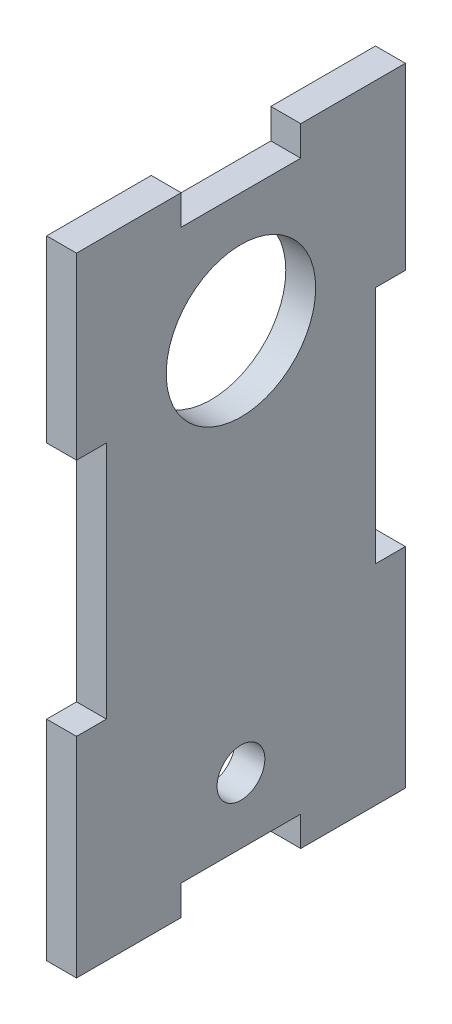
ISO-10303-21;
HEADER;
FILE_DESCRIPTION(('STEP AP214'),'2;1');
FILE_NAME('part.step','',(''),(''),'','','');
FILE_SCHEMA(('AUTOMOTIVE_DESIGN { 1 0 10303 214 1 1 1 1 }'));
ENDSEC;
DATA;
#1=APPLICATION_CONTEXT('core data for automotive mechanical design processes');
#2=APPLICATION_PROTOCOL_DEFINITION('international standard','automotive_design',2000,#1);
#3=PRODUCT_CONTEXT('',#1,'mechanical');
#4=PRODUCT('Part','Part','',(#3));
#5=PRODUCT_RELATED_PRODUCT_CATEGORY('part','',(#4));
#6=PRODUCT_DEFINITION_FORMATION('','',#4);
#7=PRODUCT_DEFINITION_CONTEXT('part definition',#1,'design');
#8=PRODUCT_DEFINITION('design','',#6,#7);
#9=PRODUCT_DEFINITION_SHAPE('','',#8);
#10=(LENGTH_UNIT() NAMED_UNIT(*) SI_UNIT(.MILLI.,.METRE.));
#11=(NAMED_UNIT(*) PLANE_ANGLE_UNIT() SI_UNIT($,.RADIAN.));
#12=(NAMED_UNIT(*) SI_UNIT($,.STERADIAN.) SOLID_ANGLE_UNIT());
#13=UNCERTAINTY_MEASURE_WITH_UNIT(LENGTH_MEASURE(1.E-05),#10,'distance_accuracy_value','');
#14=(GEOMETRIC_REPRESENTATION_CONTEXT(3) GLOBAL_UNCERTAINTY_ASSIGNED_CONTEXT((#13)) GLOBAL_UNIT_ASSIGNED_CONTEXT((#10,
#11,#12)) REPRESENTATION_CONTEXT('',''));
#15=CARTESIAN_POINT('',(0.,0.,0.));
#16=DIRECTION('',(0.,0.,1.));
#17=DIRECTION('',(1.,0.,0.));
#18=AXIS2_PLACEMENT_3D('',#15,#16,#17);
#19=CARTESIAN_POINT('',(5.,0.,0.));
#20=DIRECTION('',(1.,0.,0.));
#21=DIRECTION('',(0.,0.,-1.));
#22=AXIS2_PLACEMENT_3D('',#19,#20,#21);
#23=PLANE('',#22);
#24=CARTESIAN_POINT('',(5.,-24.9555331261844,28.9375023077633));
#25=DIRECTION('',(1.,0.,0.));
#26=DIRECTION('',(0.,0.,-1.));
#27=AXIS2_PLACEMENT_3D('',#24,#25,#26);
#28=CIRCLE('',#27,4.);
#29=CARTESIAN_POINT('',(5.,-24.9555331261844,24.9375023077633));
#30=VERTEX_POINT('',#29);
#31=EDGE_CURVE('E207',#30,#30,#28,.T.);
#32=ORIENTED_EDGE('',*,*,#31,.F.);
#33=EDGE_LOOP('',(#32));
#34=FACE_BOUND('',#33,.T.);
#35=DIRECTION('',(0.,1.,0.));
#36=VECTOR('',#35,1.);
#37=CARTESIAN_POINT('',(5.,-40.9555331261844,1.43750230776326));
#38=LINE('',#37,#36);
#39=CARTESIAN_POINT('',(5.,-40.9555331261844,1.43750230776326));
#40=VERTEX_POINT('',#39);
#41=CARTESIAN_POINT('',(5.,-5.9555331261844,1.43750230776326));
#42=VERTEX_POINT('',#41);
#43=EDGE_CURVE('E242',#40,#42,#38,.T.);
#44=ORIENTED_EDGE('',*,*,#43,.T.);
#45=DIRECTION('',(0.,0.,1.));
#46=VECTOR('',#45,1.);
#47=CARTESIAN_POINT('',(5.,-5.9555331261844,1.43750230776326));
#48=LINE('',#47,#46);
#49=CARTESIAN_POINT('',(5.,-5.9555331261844,6.43750230776328));
#50=VERTEX_POINT('',#49);
#51=EDGE_CURVE('E130',#42,#50,#48,.T.);
#52=ORIENTED_EDGE('',*,*,#51,.T.);
#53=DIRECTION('',(0.,1.,0.));
#54=VECTOR('',#53,1.);
#55=CARTESIAN_POINT('',(5.,34.0444668738156,6.43750230776327));
#56=LINE('',#55,#54);
#57=CARTESIAN_POINT('',(5.,34.0444668738156,6.43750230776327));
#58=VERTEX_POINT('',#57);
#59=EDGE_CURVE('E293',#50,#58,#56,.T.);
#60=ORIENTED_EDGE('',*,*,#59,.T.);
#61=DIRECTION('',(0.,0.,-1.));
#62=VECTOR('',#61,1.);
#63=CARTESIAN_POINT('',(5.,34.0444668738156,1.43750230776327));
#64=LINE('',#63,#62);
#65=CARTESIAN_POINT('',(5.,34.0444668738156,1.43750230776327));
#66=VERTEX_POINT('',#65);
#67=EDGE_CURVE('E312',#58,#66,#64,.T.);
#68=ORIENTED_EDGE('',*,*,#67,.T.);
#69=DIRECTION('',(0.,1.,0.));
#70=VECTOR('',#69,1.);
#71=CARTESIAN_POINT('',(5.,34.0444668738156,1.43750230776327));
#72=LINE('',#71,#70);
#73=CARTESIAN_POINT('',(5.,64.0444668738156,1.43750230776326));
#74=VERTEX_POINT('',#73);
#75=EDGE_CURVE('E309',#66,#74,#72,.T.);
#76=ORIENTED_EDGE('',*,*,#75,.T.);
#77=DIRECTION('',(0.,0.,1.));
#78=VECTOR('',#77,1.);
#79=CARTESIAN_POINT('',(5.,64.0444668738156,1.43750230776326));
#80=LINE('',#79,#78);
#81=CARTESIAN_POINT('',(5.,64.0444668738156,18.9375023077633));
#82=VERTEX_POINT('',#81);
#83=EDGE_CURVE('E311',#74,#82,#80,.T.);
#84=ORIENTED_EDGE('',*,*,#83,.T.);
#85=DIRECTION('',(0.,-1.,0.));
#86=VECTOR('',#85,1.);
#87=CARTESIAN_POINT('',(5.,64.0444668738156,18.9375023077633));
#88=LINE('',#87,#86);
#89=CARTESIAN_POINT('',(5.,59.0444668738156,18.9375023077633));
#90=VERTEX_POINT('',#89);
#91=EDGE_CURVE('E314',#82,#90,#88,.T.);
#92=ORIENTED_EDGE('',*,*,#91,.T.);
#93=DIRECTION('',(0.,0.,1.));
#94=VECTOR('',#93,1.);
#95=CARTESIAN_POINT('',(5.,59.0444668738156,38.9375023077633));
#96=LINE('',#95,#94);
#97=CARTESIAN_POINT('',(5.,59.0444668738156,38.9375023077633));
#98=VERTEX_POINT('',#97);
#99=EDGE_CURVE('E320',#90,#98,#96,.T.);
#100=ORIENTED_EDGE('',*,*,#99,.T.);
#101=DIRECTION('',(0.,1.,0.));
#102=VECTOR('',#101,1.);
#103=CARTESIAN_POINT('',(5.,64.0444668738156,38.9375023077633));
#104=LINE('',#103,#102);
#105=CARTESIAN_POINT('',(5.,64.0444668738156,38.9375023077633));
#106=VERTEX_POINT('',#105);
#107=EDGE_CURVE('E322',#98,#106,#104,.T.);
#108=ORIENTED_EDGE('',*,*,#107,.T.);
#109=DIRECTION('',(0.,0.,1.));
#110=VECTOR('',#109,1.);
#111=CARTESIAN_POINT('',(5.,64.0444668738156,38.9375023077633));
#112=LINE('',#111,#110);
#113=CARTESIAN_POINT('',(5.,64.0444668738156,56.4375023077633));
#114=VERTEX_POINT('',#113);
#115=EDGE_CURVE('E324',#106,#114,#112,.T.);
#116=ORIENTED_EDGE('',*,*,#115,.T.);
#117=DIRECTION('',(0.,-1.,0.));
#118=VECTOR('',#117,1.);
#119=CARTESIAN_POINT('',(5.,34.0444668738156,56.4375023077633));
#120=LINE('',#119,#118);
#121=CARTESIAN_POINT('',(5.,34.0444668738156,56.4375023077633));
#122=VERTEX_POINT('',#121);
#123=EDGE_CURVE('E326',#114,#122,#120,.T.);
#124=ORIENTED_EDGE('',*,*,#123,.T.);
#125=DIRECTION('',(0.,0.,-1.));
#126=VECTOR('',#125,1.);
#127=CARTESIAN_POINT('',(5.,34.0444668738156,56.4375023077633));
#128=LINE('',#127,#126);
#129=CARTESIAN_POINT('',(5.,34.0444668738156,51.4375023077633));
#130=VERTEX_POINT('',#129);
#131=EDGE_CURVE('E328',#122,#130,#128,.T.);
#132=ORIENTED_EDGE('',*,*,#131,.T.);
#133=DIRECTION('',(0.,-1.,0.));
#134=VECTOR('',#133,1.);
#135=CARTESIAN_POINT('',(5.,34.0444668738156,51.4375023077633));
#136=LINE('',#135,#134);
#137=CARTESIAN_POINT('',(5.,-5.9555331261844,51.4375023077633));
#138=VERTEX_POINT('',#137);
#139=EDGE_CURVE('E330',#130,#138,#136,.T.);
#140=ORIENTED_EDGE('',*,*,#139,.T.);
#141=DIRECTION('',(0.,0.,1.));
#142=VECTOR('',#141,1.);
#143=CARTESIAN_POINT('',(5.,-5.9555331261844,56.4375023077633));
#144=LINE('',#143,#142);
#145=CARTESIAN_POINT('',(5.,-5.9555331261844,56.4375023077633));
#146=VERTEX_POINT('',#145);
#147=EDGE_CURVE('E332',#138,#146,#144,.T.);
#148=ORIENTED_EDGE('',*,*,#147,.T.);
#149=DIRECTION('',(0.,-1.,0.));
#150=VECTOR('',#149,1.);
#151=CARTESIAN_POINT('',(5.,-40.9555331261844,56.4375023077633));
#152=LINE('',#151,#150);
#153=CARTESIAN_POINT('',(5.,-40.9555331261844,56.4375023077633));
#154=VERTEX_POINT('',#153);
#155=EDGE_CURVE('E334',#146,#154,#152,.T.);
#156=ORIENTED_EDGE('',*,*,#155,.T.);
#157=DIRECTION('',(0.,0.,-1.));
#158=VECTOR('',#157,1.);
#159=CARTESIAN_POINT('',(5.,-40.9555331261844,38.9375023077633));
#160=LINE('',#159,#158);
#161=CARTESIAN_POINT('',(5.,-40.9555331261844,38.9375023077633));
#162=VERTEX_POINT('',#161);
#163=EDGE_CURVE('E336',#154,#162,#160,.T.);
#164=ORIENTED_EDGE('',*,*,#163,.T.);
#165=DIRECTION('',(0.,1.,0.));
#166=VECTOR('',#165,1.);
#167=CARTESIAN_POINT('',(5.,-40.9555331261844,38.9375023077633));
#168=LINE('',#167,#166);
#169=CARTESIAN_POINT('',(5.,-35.9555331261844,38.9375023077633));
#170=VERTEX_POINT('',#169);
#171=EDGE_CURVE('E185',#162,#170,#168,.T.);
#172=ORIENTED_EDGE('',*,*,#171,.T.);
#173=DIRECTION('',(0.,0.,-1.));
#174=VECTOR('',#173,1.);
#175=CARTESIAN_POINT('',(5.,-35.9555331261844,38.9375023077633));
#176=LINE('',#175,#174);
#177=CARTESIAN_POINT('',(5.,-35.9555331261844,18.9375023077633));
#178=VERTEX_POINT('',#177);
#179=EDGE_CURVE('E179',#170,#178,#176,.T.);
#180=ORIENTED_EDGE('',*,*,#179,.T.);
#181=DIRECTION('',(0.,-1.,0.));
#182=VECTOR('',#181,1.);
#183=CARTESIAN_POINT('',(5.,-40.9555331261844,18.9375023077633));
#184=LINE('',#183,#182);
#185=CARTESIAN_POINT('',(5.,-40.9555331261844,18.9375023077633));
#186=VERTEX_POINT('',#185);
#187=EDGE_CURVE('E183',#178,#186,#184,.T.);
#188=ORIENTED_EDGE('',*,*,#187,.T.);
#189=DIRECTION('',(0.,0.,-1.));
#190=VECTOR('',#189,1.);
#191=CARTESIAN_POINT('',(5.,-40.9555331261844,1.43750230776326));
#192=LINE('',#191,#190);
#193=EDGE_CURVE('E51',#186,#40,#192,.T.);
#194=ORIENTED_EDGE('',*,*,#193,.T.);
#195=EDGE_LOOP('',(#44,#52,#60,#68,#76,#84,#92,#100,#108,#116,#124,#132,#140,#148,#156,#164,
#172,#180,#188,#194));
#196=FACE_BOUND('',#195,.T.);
#197=CARTESIAN_POINT('',(5.,39.0444668738156,28.9375023077633));
#198=DIRECTION('',(1.,0.,0.));
#199=DIRECTION('',(0.,0.,-1.));
#200=AXIS2_PLACEMENT_3D('',#197,#198,#199);
#201=CIRCLE('',#200,12.5);
#202=CARTESIAN_POINT('',(5.,39.0444668738156,16.4375023077633));
#203=VERTEX_POINT('',#202);
#204=EDGE_CURVE('E378',#203,#203,#201,.T.);
#205=ORIENTED_EDGE('',*,*,#204,.F.);
#206=EDGE_LOOP('',(#205));
#207=FACE_BOUND('',#206,.T.);
#208=ADVANCED_FACE('F34',(#34,#196,#207),#23,.T.);
#209=CARTESIAN_POINT('',(0.,0.,0.));
#210=DIRECTION('',(1.,0.,0.));
#211=DIRECTION('',(0.,0.,-1.));
#212=AXIS2_PLACEMENT_3D('',#209,#210,#211);
#213=PLANE('',#212);
#214=DIRECTION('',(0.,1.,0.));
#215=VECTOR('',#214,1.);
#216=CARTESIAN_POINT('',(0.,-40.9555331261844,1.43750230776326));
#217=LINE('',#216,#215);
#218=CARTESIAN_POINT('',(0.,-40.9555331261844,1.43750230776326));
#219=VERTEX_POINT('',#218);
#220=CARTESIAN_POINT('',(0.,-5.9555331261844,1.43750230776326));
#221=VERTEX_POINT('',#220);
#222=EDGE_CURVE('E203',#219,#221,#217,.T.);
#223=ORIENTED_EDGE('',*,*,#222,.F.);
#224=DIRECTION('',(0.,0.,-1.));
#225=VECTOR('',#224,1.);
#226=CARTESIAN_POINT('',(0.,-40.9555331261844,1.43750230776326));
#227=LINE('',#226,#225);
#228=CARTESIAN_POINT('',(0.,-40.9555331261844,18.9375023077633));
#229=VERTEX_POINT('',#228);
#230=EDGE_CURVE('E122',#229,#219,#227,.T.);
#231=ORIENTED_EDGE('',*,*,#230,.F.);
#232=DIRECTION('',(0.,-1.,0.));
#233=VECTOR('',#232,1.);
#234=CARTESIAN_POINT('',(0.,-40.9555331261844,18.9375023077633));
#235=LINE('',#234,#233);
#236=CARTESIAN_POINT('',(0.,-35.9555331261844,18.9375023077633));
#237=VERTEX_POINT('',#236);
#238=EDGE_CURVE('E116',#237,#229,#235,.T.);
#239=ORIENTED_EDGE('',*,*,#238,.F.);
#240=DIRECTION('',(0.,0.,-1.));
#241=VECTOR('',#240,1.);
#242=CARTESIAN_POINT('',(0.,-35.9555331261844,38.9375023077633));
#243=LINE('',#242,#241);
#244=CARTESIAN_POINT('',(0.,-35.9555331261844,38.9375023077633));
#245=VERTEX_POINT('',#244);
#246=EDGE_CURVE('E193',#245,#237,#243,.T.);
#247=ORIENTED_EDGE('',*,*,#246,.F.);
#248=DIRECTION('',(0.,1.,0.));
#249=VECTOR('',#248,1.);
#250=CARTESIAN_POINT('',(0.,-40.9555331261844,38.9375023077633));
#251=LINE('',#250,#249);
#252=CARTESIAN_POINT('',(0.,-40.9555331261844,38.9375023077633));
#253=VERTEX_POINT('',#252);
#254=EDGE_CURVE('E237',#253,#245,#251,.T.);
#255=ORIENTED_EDGE('',*,*,#254,.F.);
#256=DIRECTION('',(0.,0.,-1.));
#257=VECTOR('',#256,1.);
#258=CARTESIAN_POINT('',(0.,-40.9555331261844,38.9375023077633));
#259=LINE('',#258,#257);
#260=CARTESIAN_POINT('',(0.,-40.9555331261844,56.4375023077633));
#261=VERTEX_POINT('',#260);
#262=EDGE_CURVE('E235',#261,#253,#259,.T.);
#263=ORIENTED_EDGE('',*,*,#262,.F.);
#264=DIRECTION('',(0.,-1.,0.));
#265=VECTOR('',#264,1.);
#266=CARTESIAN_POINT('',(0.,-40.9555331261844,56.4375023077633));
#267=LINE('',#266,#265);
#268=CARTESIAN_POINT('',(0.,-5.9555331261844,56.4375023077633));
#269=VERTEX_POINT('',#268);
#270=EDGE_CURVE('E233',#269,#261,#267,.T.);
#271=ORIENTED_EDGE('',*,*,#270,.F.);
#272=DIRECTION('',(0.,0.,1.));
#273=VECTOR('',#272,1.);
#274=CARTESIAN_POINT('',(0.,-5.9555331261844,56.4375023077633));
#275=LINE('',#274,#273);
#276=CARTESIAN_POINT('',(0.,-5.9555331261844,51.4375023077633));
#277=VERTEX_POINT('',#276);
#278=EDGE_CURVE('E231',#277,#269,#275,.T.);
#279=ORIENTED_EDGE('',*,*,#278,.F.);
#280=DIRECTION('',(0.,-1.,0.));
#281=VECTOR('',#280,1.);
#282=CARTESIAN_POINT('',(0.,34.0444668738156,51.4375023077633));
#283=LINE('',#282,#281);
#284=CARTESIAN_POINT('',(0.,34.0444668738156,51.4375023077633));
#285=VERTEX_POINT('',#284);
#286=EDGE_CURVE('E229',#285,#277,#283,.T.);
#287=ORIENTED_EDGE('',*,*,#286,.F.);
#288=DIRECTION('',(0.,0.,-1.));
#289=VECTOR('',#288,1.);
#290=CARTESIAN_POINT('',(0.,34.0444668738156,56.4375023077633));
#291=LINE('',#290,#289);
#292=CARTESIAN_POINT('',(0.,34.0444668738156,56.4375023077633));
#293=VERTEX_POINT('',#292);
#294=EDGE_CURVE('E227',#293,#285,#291,.T.);
#295=ORIENTED_EDGE('',*,*,#294,.F.);
#296=DIRECTION('',(0.,-1.,0.));
#297=VECTOR('',#296,1.);
#298=CARTESIAN_POINT('',(0.,34.0444668738156,56.4375023077633));
#299=LINE('',#298,#297);
#300=CARTESIAN_POINT('',(0.,64.0444668738156,56.4375023077633));
#301=VERTEX_POINT('',#300);
#302=EDGE_CURVE('E225',#301,#293,#299,.T.);
#303=ORIENTED_EDGE('',*,*,#302,.F.);
#304=DIRECTION('',(0.,0.,1.));
#305=VECTOR('',#304,1.);
#306=CARTESIAN_POINT('',(0.,64.0444668738156,38.9375023077633));
#307=LINE('',#306,#305);
#308=CARTESIAN_POINT('',(0.,64.0444668738156,38.9375023077633));
#309=VERTEX_POINT('',#308);
#310=EDGE_CURVE('E223',#309,#301,#307,.T.);
#311=ORIENTED_EDGE('',*,*,#310,.F.);
#312=DIRECTION('',(0.,1.,0.));
#313=VECTOR('',#312,1.);
#314=CARTESIAN_POINT('',(0.,64.0444668738156,38.9375023077633));
#315=LINE('',#314,#313);
#316=CARTESIAN_POINT('',(0.,59.0444668738156,38.9375023077633));
#317=VERTEX_POINT('',#316);
#318=EDGE_CURVE('E221',#317,#309,#315,.T.);
#319=ORIENTED_EDGE('',*,*,#318,.F.);
#320=DIRECTION('',(0.,0.,1.));
#321=VECTOR('',#320,1.);
#322=CARTESIAN_POINT('',(0.,59.0444668738156,38.9375023077633));
#323=LINE('',#322,#321);
#324=CARTESIAN_POINT('',(0.,59.0444668738156,18.9375023077633));
#325=VERTEX_POINT('',#324);
#326=EDGE_CURVE('E219',#325,#317,#323,.T.);
#327=ORIENTED_EDGE('',*,*,#326,.F.);
#328=DIRECTION('',(0.,-1.,0.));
#329=VECTOR('',#328,1.);
#330=CARTESIAN_POINT('',(0.,64.0444668738156,18.9375023077633));
#331=LINE('',#330,#329);
#332=CARTESIAN_POINT('',(0.,64.0444668738156,18.9375023077633));
#333=VERTEX_POINT('',#332);
#334=EDGE_CURVE('E217',#333,#325,#331,.T.);
#335=ORIENTED_EDGE('',*,*,#334,.F.);
#336=DIRECTION('',(0.,0.,1.));
#337=VECTOR('',#336,1.);
#338=CARTESIAN_POINT('',(0.,64.0444668738156,1.43750230776326));
#339=LINE('',#338,#337);
#340=CARTESIAN_POINT('',(0.,64.0444668738156,1.43750230776326));
#341=VERTEX_POINT('',#340);
#342=EDGE_CURVE('E215',#341,#333,#339,.T.);
#343=ORIENTED_EDGE('',*,*,#342,.F.);
#344=DIRECTION('',(0.,1.,0.));
#345=VECTOR('',#344,1.);
#346=CARTESIAN_POINT('',(0.,34.0444668738156,1.43750230776327));
#347=LINE('',#346,#345);
#348=CARTESIAN_POINT('',(0.,34.0444668738156,1.43750230776327));
#349=VERTEX_POINT('',#348);
#350=EDGE_CURVE('E213',#349,#341,#347,.T.);
#351=ORIENTED_EDGE('',*,*,#350,.F.);
#352=DIRECTION('',(0.,0.,-1.));
#353=VECTOR('',#352,1.);
#354=CARTESIAN_POINT('',(0.,34.0444668738156,1.43750230776327));
#355=LINE('',#354,#353);
#356=CARTESIAN_POINT('',(0.,34.0444668738156,6.43750230776327));
#357=VERTEX_POINT('',#356);
#358=EDGE_CURVE('E211',#357,#349,#355,.T.);
#359=ORIENTED_EDGE('',*,*,#358,.F.);
#360=DIRECTION('',(0.,1.,0.));
#361=VECTOR('',#360,1.);
#362=CARTESIAN_POINT('',(0.,34.0444668738156,6.43750230776327));
#363=LINE('',#362,#361);
#364=CARTESIAN_POINT('',(0.,-5.9555331261844,6.43750230776328));
#365=VERTEX_POINT('',#364);
#366=EDGE_CURVE('E209',#365,#357,#363,.T.);
#367=ORIENTED_EDGE('',*,*,#366,.F.);
#368=DIRECTION('',(0.,0.,1.));
#369=VECTOR('',#368,1.);
#370=CARTESIAN_POINT('',(0.,-5.9555331261844,1.43750230776326));
#371=LINE('',#370,#369);
#372=EDGE_CURVE('E206',#221,#365,#371,.T.);
#373=ORIENTED_EDGE('',*,*,#372,.F.);
#374=EDGE_LOOP('',(#223,#231,#239,#247,#255,#263,#271,#279,#287,#295,#303,#311,#319,#327,#335,
#343,#351,#359,#367,#373));
#375=FACE_BOUND('',#374,.T.);
#376=CARTESIAN_POINT('',(0.,-24.9555331261844,28.9375023077633));
#377=DIRECTION('',(1.,0.,0.));
#378=DIRECTION('',(0.,0.,-1.));
#379=AXIS2_PLACEMENT_3D('',#376,#377,#378);
#380=CIRCLE('',#379,4.);
#381=CARTESIAN_POINT('',(0.,-24.9555331261844,24.9375023077633));
#382=VERTEX_POINT('',#381);
#383=EDGE_CURVE('E384',#382,#382,#380,.T.);
#384=ORIENTED_EDGE('',*,*,#383,.T.);
#385=EDGE_LOOP('',(#384));
#386=FACE_BOUND('',#385,.T.);
#387=CARTESIAN_POINT('',(0.,39.0444668738156,28.9375023077633));
#388=DIRECTION('',(1.,0.,0.));
#389=DIRECTION('',(0.,0.,-1.));
#390=AXIS2_PLACEMENT_3D('',#387,#388,#389);
#391=CIRCLE('',#390,12.5);
#392=CARTESIAN_POINT('',(0.,39.0444668738156,16.4375023077633));
#393=VERTEX_POINT('',#392);
#394=EDGE_CURVE('E381',#393,#393,#391,.T.);
#395=ORIENTED_EDGE('',*,*,#394,.T.);
#396=EDGE_LOOP('',(#395));
#397=FACE_BOUND('',#396,.T.);
#398=ADVANCED_FACE('F297',(#375,#386,#397),#213,.F.);
#399=CARTESIAN_POINT('',(5.,-40.9555331261844,1.43750230776326));
#400=DIRECTION('',(0.,0.,1.));
#401=DIRECTION('',(0.,-1.,0.));
#402=AXIS2_PLACEMENT_3D('',#399,#400,#401);
#403=PLANE('',#402);
#404=ORIENTED_EDGE('',*,*,#222,.T.);
#405=DIRECTION('',(-1.,0.,0.));
#406=VECTOR('',#405,1.);
#407=CARTESIAN_POINT('',(5.,-5.9555331261844,1.43750230776326));
#408=LINE('',#407,#406);
#409=EDGE_CURVE('E11',#42,#221,#408,.T.);
#410=ORIENTED_EDGE('',*,*,#409,.F.);
#411=ORIENTED_EDGE('',*,*,#43,.F.);
#412=DIRECTION('',(-1.,0.,0.));
#413=VECTOR('',#412,1.);
#414=CARTESIAN_POINT('',(5.,-40.9555331261844,1.43750230776326));
#415=LINE('',#414,#413);
#416=EDGE_CURVE('E199',#40,#219,#415,.T.);
#417=ORIENTED_EDGE('',*,*,#416,.T.);
#418=EDGE_LOOP('',(#404,#410,#411,#417));
#419=FACE_BOUND('',#418,.T.);
#420=ADVANCED_FACE('F36',(#419),#403,.F.);
#421=CARTESIAN_POINT('',(5.,-5.9555331261844,1.43750230776326));
#422=DIRECTION('',(0.,-1.,0.));
#423=DIRECTION('',(0.,0.,-1.));
#424=AXIS2_PLACEMENT_3D('',#421,#422,#423);
#425=PLANE('',#424);
#426=ORIENTED_EDGE('',*,*,#372,.T.);
#427=DIRECTION('',(-1.,0.,0.));
#428=VECTOR('',#427,1.);
#429=CARTESIAN_POINT('',(5.,-5.9555331261844,6.43750230776328));
#430=LINE('',#429,#428);
#431=EDGE_CURVE('E43',#50,#365,#430,.T.);
#432=ORIENTED_EDGE('',*,*,#431,.F.);
#433=ORIENTED_EDGE('',*,*,#51,.F.);
#434=ORIENTED_EDGE('',*,*,#409,.T.);
#435=EDGE_LOOP('',(#426,#432,#433,#434));
#436=FACE_BOUND('',#435,.T.);
#437=ADVANCED_FACE('F557',(#436),#425,.F.);
#438=CARTESIAN_POINT('',(5.,34.0444668738156,6.43750230776327));
#439=DIRECTION('',(0.,0.,1.));
#440=DIRECTION('',(0.,-1.,0.));
#441=AXIS2_PLACEMENT_3D('',#438,#439,#440);
#442=PLANE('',#441);
#443=ORIENTED_EDGE('',*,*,#366,.T.);
#444=DIRECTION('',(-1.,0.,0.));
#445=VECTOR('',#444,1.);
#446=CARTESIAN_POINT('',(5.,34.0444668738156,6.43750230776327));
#447=LINE('',#446,#445);
#448=EDGE_CURVE('E285',#58,#357,#447,.T.);
#449=ORIENTED_EDGE('',*,*,#448,.F.);
#450=ORIENTED_EDGE('',*,*,#59,.F.);
#451=ORIENTED_EDGE('',*,*,#431,.T.);
#452=EDGE_LOOP('',(#443,#449,#450,#451));
#453=FACE_BOUND('',#452,.T.);
#454=ADVANCED_FACE('F291',(#453),#442,.F.);
#455=CARTESIAN_POINT('',(5.,34.0444668738156,1.43750230776327));
#456=DIRECTION('',(0.,1.,0.));
#457=DIRECTION('',(0.,0.,1.));
#458=AXIS2_PLACEMENT_3D('',#455,#456,#457);
#459=PLANE('',#458);
#460=ORIENTED_EDGE('',*,*,#358,.T.);
#461=DIRECTION('',(-1.,0.,0.));
#462=VECTOR('',#461,1.);
#463=CARTESIAN_POINT('',(5.,34.0444668738156,1.43750230776327));
#464=LINE('',#463,#462);
#465=EDGE_CURVE('E282',#66,#349,#464,.T.);
#466=ORIENTED_EDGE('',*,*,#465,.F.);
#467=ORIENTED_EDGE('',*,*,#67,.F.);
#468=ORIENTED_EDGE('',*,*,#448,.T.);
#469=EDGE_LOOP('',(#460,#466,#467,#468));
#470=FACE_BOUND('',#469,.T.);
#471=ADVANCED_FACE('F303',(#470),#459,.F.);
#472=CARTESIAN_POINT('',(5.,34.0444668738156,1.43750230776327));
#473=DIRECTION('',(0.,0.,1.));
#474=DIRECTION('',(0.,-1.,0.));
#475=AXIS2_PLACEMENT_3D('',#472,#473,#474);
#476=PLANE('',#475);
#477=ORIENTED_EDGE('',*,*,#350,.T.);
#478=DIRECTION('',(-1.,0.,0.));
#479=VECTOR('',#478,1.);
#480=CARTESIAN_POINT('',(5.,64.0444668738156,1.43750230776326));
#481=LINE('',#480,#479);
#482=EDGE_CURVE('E279',#74,#341,#481,.T.);
#483=ORIENTED_EDGE('',*,*,#482,.F.);
#484=ORIENTED_EDGE('',*,*,#75,.F.);
#485=ORIENTED_EDGE('',*,*,#465,.T.);
#486=EDGE_LOOP('',(#477,#483,#484,#485));
#487=FACE_BOUND('',#486,.T.);
#488=ADVANCED_FACE('F307',(#487),#476,.F.);
#489=CARTESIAN_POINT('',(5.,64.0444668738156,1.43750230776326));
#490=DIRECTION('',(0.,-1.,0.));
#491=DIRECTION('',(0.,0.,-1.));
#492=AXIS2_PLACEMENT_3D('',#489,#490,#491);
#493=PLANE('',#492);
#494=ORIENTED_EDGE('',*,*,#342,.T.);
#495=DIRECTION('',(-1.,0.,0.));
#496=VECTOR('',#495,1.);
#497=CARTESIAN_POINT('',(5.,64.0444668738156,18.9375023077633));
#498=LINE('',#497,#496);
#499=EDGE_CURVE('E276',#82,#333,#498,.T.);
#500=ORIENTED_EDGE('',*,*,#499,.F.);
#501=ORIENTED_EDGE('',*,*,#83,.F.);
#502=ORIENTED_EDGE('',*,*,#482,.T.);
#503=EDGE_LOOP('',(#494,#500,#501,#502));
#504=FACE_BOUND('',#503,.T.);
#505=ADVANCED_FACE('F522',(#504),#493,.F.);
#506=CARTESIAN_POINT('',(5.,64.0444668738156,18.9375023077633));
#507=DIRECTION('',(0.,0.,-1.));
#508=DIRECTION('',(0.,1.,0.));
#509=AXIS2_PLACEMENT_3D('',#506,#507,#508);
#510=PLANE('',#509);
#511=ORIENTED_EDGE('',*,*,#334,.T.);
#512=DIRECTION('',(-1.,0.,0.));
#513=VECTOR('',#512,1.);
#514=CARTESIAN_POINT('',(5.,59.0444668738156,18.9375023077633));
#515=LINE('',#514,#513);
#516=EDGE_CURVE('E273',#90,#325,#515,.T.);
#517=ORIENTED_EDGE('',*,*,#516,.F.);
#518=ORIENTED_EDGE('',*,*,#91,.F.);
#519=ORIENTED_EDGE('',*,*,#499,.T.);
#520=EDGE_LOOP('',(#511,#517,#518,#519));
#521=FACE_BOUND('',#520,.T.);
#522=ADVANCED_FACE('F512',(#521),#510,.F.);
#523=CARTESIAN_POINT('',(5.,59.0444668738156,38.9375023077633));
#524=DIRECTION('',(0.,-1.,0.));
#525=DIRECTION('',(0.,0.,-1.));
#526=AXIS2_PLACEMENT_3D('',#523,#524,#525);
#527=PLANE('',#526);
#528=ORIENTED_EDGE('',*,*,#326,.T.);
#529=DIRECTION('',(-1.,0.,0.));
#530=VECTOR('',#529,1.);
#531=CARTESIAN_POINT('',(5.,59.0444668738156,38.9375023077633));
#532=LINE('',#531,#530);
#533=EDGE_CURVE('E270',#98,#317,#532,.T.);
#534=ORIENTED_EDGE('',*,*,#533,.F.);
#535=ORIENTED_EDGE('',*,*,#99,.F.);
#536=ORIENTED_EDGE('',*,*,#516,.T.);
#537=EDGE_LOOP('',(#528,#534,#535,#536));
#538=FACE_BOUND('',#537,.T.);
#539=ADVANCED_FACE('F502',(#538),#527,.F.);
#540=CARTESIAN_POINT('',(5.,64.0444668738156,38.9375023077633));
#541=DIRECTION('',(0.,0.,1.));
#542=DIRECTION('',(1.,0.,0.));
#543=AXIS2_PLACEMENT_3D('',#540,#541,#542);
#544=PLANE('',#543);
#545=ORIENTED_EDGE('',*,*,#318,.T.);
#546=DIRECTION('',(-1.,0.,0.));
#547=VECTOR('',#546,1.);
#548=CARTESIAN_POINT('',(5.,64.0444668738156,38.9375023077633));
#549=LINE('',#548,#547);
#550=EDGE_CURVE('E267',#106,#309,#549,.T.);
#551=ORIENTED_EDGE('',*,*,#550,.F.);
#552=ORIENTED_EDGE('',*,*,#107,.F.);
#553=ORIENTED_EDGE('',*,*,#533,.T.);
#554=EDGE_LOOP('',(#545,#551,#552,#553));
#555=FACE_BOUND('',#554,.T.);
#556=ADVANCED_FACE('F492',(#555),#544,.F.);
#557=CARTESIAN_POINT('',(5.,64.0444668738156,38.9375023077633));
#558=DIRECTION('',(0.,-1.,0.));
#559=DIRECTION('',(0.,0.,-1.));
#560=AXIS2_PLACEMENT_3D('',#557,#558,#559);
#561=PLANE('',#560);
#562=ORIENTED_EDGE('',*,*,#310,.T.);
#563=DIRECTION('',(-1.,0.,0.));
#564=VECTOR('',#563,1.);
#565=CARTESIAN_POINT('',(5.,64.0444668738156,56.4375023077633));
#566=LINE('',#565,#564);
#567=EDGE_CURVE('E264',#114,#301,#566,.T.);
#568=ORIENTED_EDGE('',*,*,#567,.F.);
#569=ORIENTED_EDGE('',*,*,#115,.F.);
#570=ORIENTED_EDGE('',*,*,#550,.T.);
#571=EDGE_LOOP('',(#562,#568,#569,#570));
#572=FACE_BOUND('',#571,.T.);
#573=ADVANCED_FACE('F482',(#572),#561,.F.);
#574=CARTESIAN_POINT('',(5.,34.0444668738156,56.4375023077633));
#575=DIRECTION('',(0.,0.,-1.));
#576=DIRECTION('',(-1.,0.,0.));
#577=AXIS2_PLACEMENT_3D('',#574,#575,#576);
#578=PLANE('',#577);
#579=ORIENTED_EDGE('',*,*,#302,.T.);
#580=DIRECTION('',(-1.,0.,0.));
#581=VECTOR('',#580,1.);
#582=CARTESIAN_POINT('',(5.,34.0444668738156,56.4375023077633));
#583=LINE('',#582,#581);
#584=EDGE_CURVE('E261',#122,#293,#583,.T.);
#585=ORIENTED_EDGE('',*,*,#584,.F.);
#586=ORIENTED_EDGE('',*,*,#123,.F.);
#587=ORIENTED_EDGE('',*,*,#567,.T.);
#588=EDGE_LOOP('',(#579,#585,#586,#587));
#589=FACE_BOUND('',#588,.T.);
#590=ADVANCED_FACE('F472',(#589),#578,.F.);
#591=CARTESIAN_POINT('',(5.,34.0444668738156,56.4375023077633));
#592=DIRECTION('',(0.,1.,0.));
#593=DIRECTION('',(0.,0.,1.));
#594=AXIS2_PLACEMENT_3D('',#591,#592,#593);
#595=PLANE('',#594);
#596=ORIENTED_EDGE('',*,*,#294,.T.);
#597=DIRECTION('',(-1.,0.,0.));
#598=VECTOR('',#597,1.);
#599=CARTESIAN_POINT('',(5.,34.0444668738156,51.4375023077633));
#600=LINE('',#599,#598);
#601=EDGE_CURVE('E258',#130,#285,#600,.T.);
#602=ORIENTED_EDGE('',*,*,#601,.F.);
#603=ORIENTED_EDGE('',*,*,#131,.F.);
#604=ORIENTED_EDGE('',*,*,#584,.T.);
#605=EDGE_LOOP('',(#596,#602,#603,#604));
#606=FACE_BOUND('',#605,.T.);
#607=ADVANCED_FACE('F462',(#606),#595,.F.);
#608=CARTESIAN_POINT('',(5.,34.0444668738156,51.4375023077633));
#609=DIRECTION('',(0.,0.,-1.));
#610=DIRECTION('',(0.,1.,0.));
#611=AXIS2_PLACEMENT_3D('',#608,#609,#610);
#612=PLANE('',#611);
#613=ORIENTED_EDGE('',*,*,#286,.T.);
#614=DIRECTION('',(-1.,0.,0.));
#615=VECTOR('',#614,1.);
#616=CARTESIAN_POINT('',(5.,-5.9555331261844,51.4375023077633));
#617=LINE('',#616,#615);
#618=EDGE_CURVE('E255',#138,#277,#617,.T.);
#619=ORIENTED_EDGE('',*,*,#618,.F.);
#620=ORIENTED_EDGE('',*,*,#139,.F.);
#621=ORIENTED_EDGE('',*,*,#601,.T.);
#622=EDGE_LOOP('',(#613,#619,#620,#621));
#623=FACE_BOUND('',#622,.T.);
#624=ADVANCED_FACE('F452',(#623),#612,.F.);
#625=CARTESIAN_POINT('',(5.,-5.9555331261844,56.4375023077633));
#626=DIRECTION('',(0.,-1.,0.));
#627=DIRECTION('',(0.,0.,-1.));
#628=AXIS2_PLACEMENT_3D('',#625,#626,#627);
#629=PLANE('',#628);
#630=ORIENTED_EDGE('',*,*,#278,.T.);
#631=DIRECTION('',(-1.,0.,0.));
#632=VECTOR('',#631,1.);
#633=CARTESIAN_POINT('',(5.,-5.9555331261844,56.4375023077633));
#634=LINE('',#633,#632);
#635=EDGE_CURVE('E252',#146,#269,#634,.T.);
#636=ORIENTED_EDGE('',*,*,#635,.F.);
#637=ORIENTED_EDGE('',*,*,#147,.F.);
#638=ORIENTED_EDGE('',*,*,#618,.T.);
#639=EDGE_LOOP('',(#630,#636,#637,#638));
#640=FACE_BOUND('',#639,.T.);
#641=ADVANCED_FACE('F442',(#640),#629,.F.);
#642=CARTESIAN_POINT('',(5.,-40.9555331261844,56.4375023077633));
#643=DIRECTION('',(0.,0.,-1.));
#644=DIRECTION('',(-1.,0.,0.));
#645=AXIS2_PLACEMENT_3D('',#642,#643,#644);
#646=PLANE('',#645);
#647=ORIENTED_EDGE('',*,*,#270,.T.);
#648=DIRECTION('',(-1.,0.,0.));
#649=VECTOR('',#648,1.);
#650=CARTESIAN_POINT('',(5.,-40.9555331261844,56.4375023077633));
#651=LINE('',#650,#649);
#652=EDGE_CURVE('E249',#154,#261,#651,.T.);
#653=ORIENTED_EDGE('',*,*,#652,.F.);
#654=ORIENTED_EDGE('',*,*,#155,.F.);
#655=ORIENTED_EDGE('',*,*,#635,.T.);
#656=EDGE_LOOP('',(#647,#653,#654,#655));
#657=FACE_BOUND('',#656,.T.);
#658=ADVANCED_FACE('F433',(#657),#646,.F.);
#659=CARTESIAN_POINT('',(5.,-40.9555331261844,38.9375023077633));
#660=DIRECTION('',(0.,1.,0.));
#661=DIRECTION('',(0.,0.,1.));
#662=AXIS2_PLACEMENT_3D('',#659,#660,#661);
#663=PLANE('',#662);
#664=ORIENTED_EDGE('',*,*,#262,.T.);
#665=DIRECTION('',(-1.,0.,0.));
#666=VECTOR('',#665,1.);
#667=CARTESIAN_POINT('',(5.,-40.9555331261844,38.9375023077633));
#668=LINE('',#667,#666);
#669=EDGE_CURVE('E246',#162,#253,#668,.T.);
#670=ORIENTED_EDGE('',*,*,#669,.F.);
#671=ORIENTED_EDGE('',*,*,#163,.F.);
#672=ORIENTED_EDGE('',*,*,#652,.T.);
#673=EDGE_LOOP('',(#664,#670,#671,#672));
#674=FACE_BOUND('',#673,.T.);
#675=ADVANCED_FACE('F342',(#674),#663,.F.);
#676=CARTESIAN_POINT('',(5.,-40.9555331261844,38.9375023077633));
#677=DIRECTION('',(0.,0.,1.));
#678=DIRECTION('',(1.,0.,0.));
#679=AXIS2_PLACEMENT_3D('',#676,#677,#678);
#680=PLANE('',#679);
#681=ORIENTED_EDGE('',*,*,#254,.T.);
#682=DIRECTION('',(-1.,0.,0.));
#683=VECTOR('',#682,1.);
#684=CARTESIAN_POINT('',(5.,-35.9555331261844,38.9375023077633));
#685=LINE('',#684,#683);
#686=EDGE_CURVE('E194',#170,#245,#685,.T.);
#687=ORIENTED_EDGE('',*,*,#686,.F.);
#688=ORIENTED_EDGE('',*,*,#171,.F.);
#689=ORIENTED_EDGE('',*,*,#669,.T.);
#690=EDGE_LOOP('',(#681,#687,#688,#689));
#691=FACE_BOUND('',#690,.T.);
#692=ADVANCED_FACE('F346',(#691),#680,.F.);
#693=CARTESIAN_POINT('',(5.,-35.9555331261844,38.9375023077633));
#694=DIRECTION('',(0.,1.,0.));
#695=DIRECTION('',(0.,0.,1.));
#696=AXIS2_PLACEMENT_3D('',#693,#694,#695);
#697=PLANE('',#696);
#698=ORIENTED_EDGE('',*,*,#246,.T.);
#699=DIRECTION('',(-1.,0.,0.));
#700=VECTOR('',#699,1.);
#701=CARTESIAN_POINT('',(5.,-35.9555331261844,18.9375023077633));
#702=LINE('',#701,#700);
#703=EDGE_CURVE('E190',#178,#237,#702,.T.);
#704=ORIENTED_EDGE('',*,*,#703,.F.);
#705=ORIENTED_EDGE('',*,*,#179,.F.);
#706=ORIENTED_EDGE('',*,*,#686,.T.);
#707=EDGE_LOOP('',(#698,#704,#705,#706));
#708=FACE_BOUND('',#707,.T.);
#709=ADVANCED_FACE('F191',(#708),#697,.F.);
#710=CARTESIAN_POINT('',(5.,-40.9555331261844,18.9375023077633));
#711=DIRECTION('',(0.,0.,-1.));
#712=DIRECTION('',(-1.,0.,0.));
#713=AXIS2_PLACEMENT_3D('',#710,#711,#712);
#714=PLANE('',#713);
#715=ORIENTED_EDGE('',*,*,#238,.T.);
#716=DIRECTION('',(-1.,0.,0.));
#717=VECTOR('',#716,1.);
#718=CARTESIAN_POINT('',(5.,-40.9555331261844,18.9375023077633));
#719=LINE('',#718,#717);
#720=EDGE_CURVE('E195',#186,#229,#719,.T.);
#721=ORIENTED_EDGE('',*,*,#720,.F.);
#722=ORIENTED_EDGE('',*,*,#187,.F.);
#723=ORIENTED_EDGE('',*,*,#703,.T.);
#724=EDGE_LOOP('',(#715,#721,#722,#723));
#725=FACE_BOUND('',#724,.T.);
#726=ADVANCED_FACE('F197',(#725),#714,.F.);
#727=CARTESIAN_POINT('',(5.,-40.9555331261844,1.43750230776326));
#728=DIRECTION('',(0.,1.,0.));
#729=DIRECTION('',(0.,0.,1.));
#730=AXIS2_PLACEMENT_3D('',#727,#728,#729);
#731=PLANE('',#730);
#732=ORIENTED_EDGE('',*,*,#230,.T.);
#733=ORIENTED_EDGE('',*,*,#416,.F.);
#734=ORIENTED_EDGE('',*,*,#193,.F.);
#735=ORIENTED_EDGE('',*,*,#720,.T.);
#736=EDGE_LOOP('',(#732,#733,#734,#735));
#737=FACE_BOUND('',#736,.T.);
#738=ADVANCED_FACE('F350',(#737),#731,.F.);
#739=CARTESIAN_POINT('',(5.,-24.9555331261844,28.9375023077633));
#740=DIRECTION('',(-1.,0.,0.));
#741=DIRECTION('',(0.,0.,1.));
#742=AXIS2_PLACEMENT_3D('',#739,#740,#741);
#743=CYLINDRICAL_SURFACE('',#742,4.);
#744=ORIENTED_EDGE('',*,*,#31,.T.);
#745=EDGE_LOOP('',(#744));
#746=FACE_BOUND('',#745,.T.);
#747=ORIENTED_EDGE('',*,*,#383,.F.);
#748=EDGE_LOOP('',(#747));
#749=FACE_BOUND('',#748,.T.);
#750=ADVANCED_FACE('F352',(#746,#749),#743,.F.);
#751=CARTESIAN_POINT('',(5.,39.0444668738156,28.9375023077633));
#752=DIRECTION('',(-1.,0.,0.));
#753=DIRECTION('',(0.,0.,1.));
#754=AXIS2_PLACEMENT_3D('',#751,#752,#753);
#755=CYLINDRICAL_SURFACE('',#754,12.5);
#756=ORIENTED_EDGE('',*,*,#204,.T.);
#757=EDGE_LOOP('',(#756));
#758=FACE_BOUND('',#757,.T.);
#759=ORIENTED_EDGE('',*,*,#394,.F.);
#760=EDGE_LOOP('',(#759));
#761=FACE_BOUND('',#760,.T.);
#762=ADVANCED_FACE('F358',(#758,#761),#755,.F.);
#763=CLOSED_SHELL('',(#208,#398,#420,#437,#454,#471,#488,#505,#522,#539,#556,#573,#590,#607,
#624,#641,#658,#675,#692,#709,#726,#738,#750,#762));
#764=MANIFOLD_SOLID_BREP('B2',#763);
#765=ADVANCED_BREP_SHAPE_REPRESENTATION('',(#18,#764),#14);
#766=SHAPE_DEFINITION_REPRESENTATION(#9,#765);
ENDSEC;
END-ISO-10303-21;
